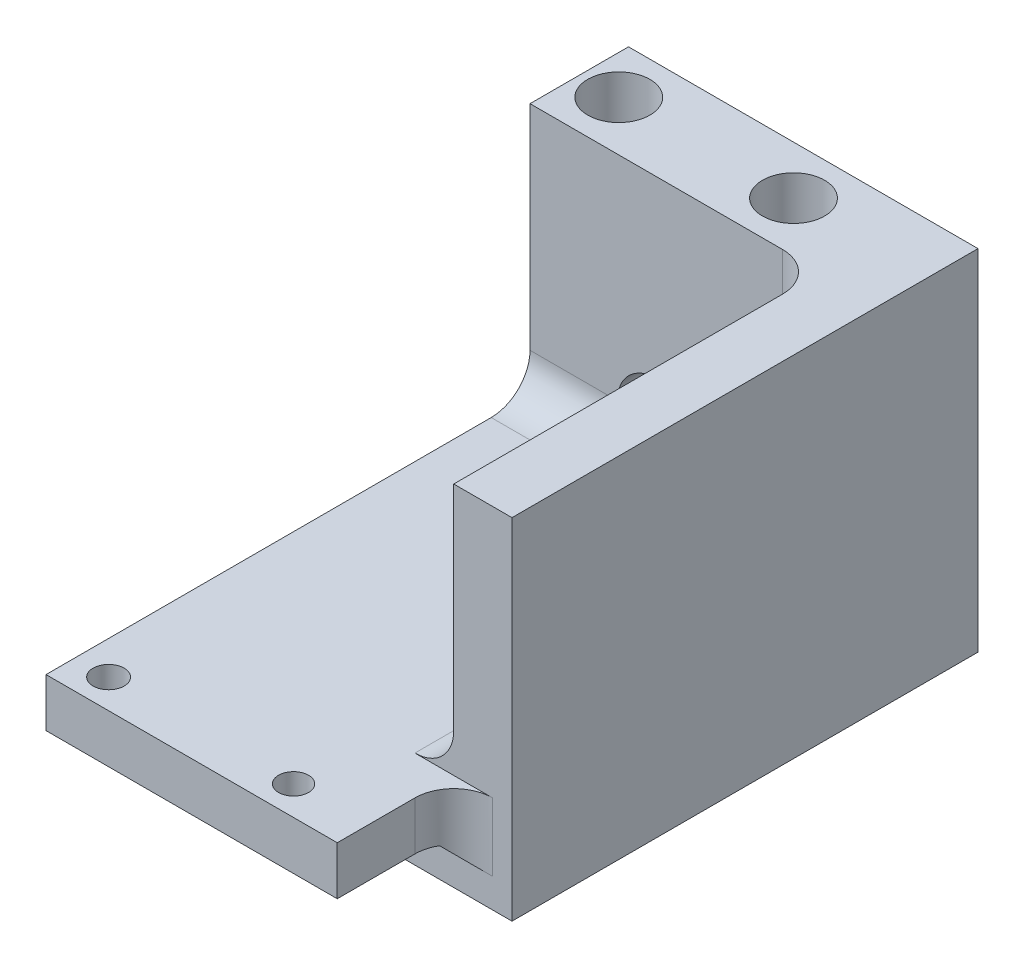
ISO-10303-21;
HEADER;
FILE_DESCRIPTION(('STEP AP214'),'2;1');
FILE_NAME('part.step','',(''),(''),'','','');
FILE_SCHEMA(('AUTOMOTIVE_DESIGN { 1 0 10303 214 1 1 1 1 }'));
ENDSEC;
DATA;
#1=APPLICATION_CONTEXT('core data for automotive mechanical design processes');
#2=APPLICATION_PROTOCOL_DEFINITION('international standard','automotive_design',2000,#1);
#3=PRODUCT_CONTEXT('',#1,'mechanical');
#4=PRODUCT('Part','Part','',(#3));
#5=PRODUCT_RELATED_PRODUCT_CATEGORY('part','',(#4));
#6=PRODUCT_DEFINITION_FORMATION('','',#4);
#7=PRODUCT_DEFINITION_CONTEXT('part definition',#1,'design');
#8=PRODUCT_DEFINITION('design','',#6,#7);
#9=PRODUCT_DEFINITION_SHAPE('','',#8);
#10=(LENGTH_UNIT() NAMED_UNIT(*) SI_UNIT(.MILLI.,.METRE.));
#11=(NAMED_UNIT(*) PLANE_ANGLE_UNIT() SI_UNIT($,.RADIAN.));
#12=(NAMED_UNIT(*) SI_UNIT($,.STERADIAN.) SOLID_ANGLE_UNIT());
#13=UNCERTAINTY_MEASURE_WITH_UNIT(LENGTH_MEASURE(1.E-05),#10,'distance_accuracy_value','');
#14=(GEOMETRIC_REPRESENTATION_CONTEXT(3) GLOBAL_UNCERTAINTY_ASSIGNED_CONTEXT((#13)) GLOBAL_UNIT_ASSIGNED_CONTEXT((#10,
#11,#12)) REPRESENTATION_CONTEXT('',''));
#15=CARTESIAN_POINT('',(0.,0.,0.));
#16=DIRECTION('',(0.,0.,1.));
#17=DIRECTION('',(1.,0.,0.));
#18=AXIS2_PLACEMENT_3D('',#15,#16,#17);
#19=CARTESIAN_POINT('',(30.,36.,0.));
#20=DIRECTION('',(-1.,0.,0.));
#21=DIRECTION('',(0.,0.,1.));
#22=AXIS2_PLACEMENT_3D('',#19,#20,#21);
#23=PLANE('',#22);
#24=DIRECTION('',(0.,0.,1.));
#25=VECTOR('',#24,1.);
#26=CARTESIAN_POINT('',(30.,5.,0.));
#27=LINE('',#26,#25);
#28=CARTESIAN_POINT('',(30.,5.,-8.));
#29=VERTEX_POINT('',#28);
#30=CARTESIAN_POINT('',(30.,5.,0.));
#31=VERTEX_POINT('',#30);
#32=EDGE_CURVE('E221',#29,#31,#27,.T.);
#33=ORIENTED_EDGE('',*,*,#32,.F.);
#34=DIRECTION('',(0.,-1.,0.));
#35=VECTOR('',#34,1.);
#36=CARTESIAN_POINT('',(30.,10.,-8.));
#37=LINE('',#36,#35);
#38=CARTESIAN_POINT('',(30.,10.,-8.));
#39=VERTEX_POINT('',#38);
#40=EDGE_CURVE('E288',#29,#39,#37,.F.);
#41=ORIENTED_EDGE('',*,*,#40,.T.);
#42=DIRECTION('',(0.,0.,-1.));
#43=VECTOR('',#42,1.);
#44=CARTESIAN_POINT('',(30.,10.,0.));
#45=LINE('',#44,#43);
#46=CARTESIAN_POINT('',(30.,10.,0.));
#47=VERTEX_POINT('',#46);
#48=EDGE_CURVE('E235',#47,#39,#45,.T.);
#49=ORIENTED_EDGE('',*,*,#48,.F.);
#50=DIRECTION('',(0.,-1.,0.));
#51=VECTOR('',#50,1.);
#52=CARTESIAN_POINT('',(30.,36.,0.));
#53=LINE('',#52,#51);
#54=EDGE_CURVE('E263',#47,#31,#53,.T.);
#55=ORIENTED_EDGE('',*,*,#54,.T.);
#56=EDGE_LOOP('',(#33,#41,#49,#55));
#57=FACE_BOUND('',#56,.T.);
#58=ADVANCED_FACE('F45',(#57),#23,.F.);
#59=CARTESIAN_POINT('',(4.,36.,-55.));
#60=DIRECTION('',(0.,-1.,0.));
#61=DIRECTION('',(0.,0.,-1.));
#62=AXIS2_PLACEMENT_3D('',#59,#60,#61);
#63=CYLINDRICAL_SURFACE('',#62,1.6);
#64=CARTESIAN_POINT('',(4.,0.,-55.));
#65=DIRECTION('',(0.,1.,0.));
#66=DIRECTION('',(0.,0.,1.));
#67=AXIS2_PLACEMENT_3D('',#64,#65,#66);
#68=CIRCLE('',#67,1.6);
#69=CARTESIAN_POINT('',(4.,0.,-53.4));
#70=VERTEX_POINT('',#69);
#71=EDGE_CURVE('E249',#70,#70,#68,.T.);
#72=ORIENTED_EDGE('',*,*,#71,.F.);
#73=EDGE_LOOP('',(#72));
#74=FACE_BOUND('',#73,.T.);
#75=CARTESIAN_POINT('',(4.,10.,-55.));
#76=DIRECTION('',(0.,1.,0.));
#77=DIRECTION('',(0.,0.,1.));
#78=AXIS2_PLACEMENT_3D('',#75,#76,#77);
#79=CIRCLE('',#78,1.6);
#80=CARTESIAN_POINT('',(4.,10.,-53.4));
#81=VERTEX_POINT('',#80);
#82=EDGE_CURVE('E173',#81,#81,#79,.T.);
#83=ORIENTED_EDGE('',*,*,#82,.T.);
#84=EDGE_LOOP('',(#83));
#85=FACE_BOUND('',#84,.T.);
#86=ADVANCED_FACE('F390',(#74,#85),#63,.F.);
#87=CARTESIAN_POINT('',(22.,36.,-55.));
#88=DIRECTION('',(0.,-1.,0.));
#89=DIRECTION('',(0.,0.,-1.));
#90=AXIS2_PLACEMENT_3D('',#87,#88,#89);
#91=CYLINDRICAL_SURFACE('',#90,1.6);
#92=CARTESIAN_POINT('',(22.,0.,-55.));
#93=DIRECTION('',(0.,1.,0.));
#94=DIRECTION('',(0.,0.,1.));
#95=AXIS2_PLACEMENT_3D('',#92,#93,#94);
#96=CIRCLE('',#95,1.6);
#97=CARTESIAN_POINT('',(22.,0.,-53.4));
#98=VERTEX_POINT('',#97);
#99=EDGE_CURVE('E246',#98,#98,#96,.T.);
#100=ORIENTED_EDGE('',*,*,#99,.F.);
#101=EDGE_LOOP('',(#100));
#102=FACE_BOUND('',#101,.T.);
#103=CARTESIAN_POINT('',(22.,10.,-55.));
#104=DIRECTION('',(0.,1.,0.));
#105=DIRECTION('',(0.,0.,1.));
#106=AXIS2_PLACEMENT_3D('',#103,#104,#105);
#107=CIRCLE('',#106,1.6);
#108=CARTESIAN_POINT('',(22.,10.,-53.4));
#109=VERTEX_POINT('',#108);
#110=EDGE_CURVE('E210',#109,#109,#107,.T.);
#111=ORIENTED_EDGE('',*,*,#110,.T.);
#112=EDGE_LOOP('',(#111));
#113=FACE_BOUND('',#112,.T.);
#114=ADVANCED_FACE('F397',(#102,#113),#91,.F.);
#115=CARTESIAN_POINT('',(0.,36.,0.));
#116=DIRECTION('',(0.,0.,-1.));
#117=DIRECTION('',(-1.,0.,0.));
#118=AXIS2_PLACEMENT_3D('',#115,#116,#117);
#119=PLANE('',#118);
#120=DIRECTION('',(-1.,0.,0.));
#121=VECTOR('',#120,1.);
#122=CARTESIAN_POINT('',(0.,5.,0.));
#123=LINE('',#122,#121);
#124=CARTESIAN_POINT('',(0.,5.,0.));
#125=VERTEX_POINT('',#124);
#126=EDGE_CURVE('E223',#31,#125,#123,.T.);
#127=ORIENTED_EDGE('',*,*,#126,.F.);
#128=ORIENTED_EDGE('',*,*,#54,.F.);
#129=DIRECTION('',(1.,0.,0.));
#130=VECTOR('',#129,1.);
#131=CARTESIAN_POINT('',(0.,10.,0.));
#132=LINE('',#131,#130);
#133=CARTESIAN_POINT('',(0.,10.,0.));
#134=VERTEX_POINT('',#133);
#135=EDGE_CURVE('E233',#134,#47,#132,.T.);
#136=ORIENTED_EDGE('',*,*,#135,.F.);
#137=DIRECTION('',(0.,-1.,0.));
#138=VECTOR('',#137,1.);
#139=CARTESIAN_POINT('',(0.,36.,0.));
#140=LINE('',#139,#138);
#141=EDGE_CURVE('E266',#134,#125,#140,.T.);
#142=ORIENTED_EDGE('',*,*,#141,.T.);
#143=EDGE_LOOP('',(#127,#128,#136,#142));
#144=FACE_BOUND('',#143,.T.);
#145=ADVANCED_FACE('F385',(#144),#119,.F.);
#146=CARTESIAN_POINT('',(3.45,36.,-3.));
#147=DIRECTION('',(0.,-1.,0.));
#148=DIRECTION('',(0.,0.,-1.));
#149=AXIS2_PLACEMENT_3D('',#146,#147,#148);
#150=CYLINDRICAL_SURFACE('',#149,1.6);
#151=CARTESIAN_POINT('',(3.45,10.,-3.));
#152=DIRECTION('',(0.,-1.,0.));
#153=DIRECTION('',(0.,0.,-1.));
#154=AXIS2_PLACEMENT_3D('',#151,#152,#153);
#155=CIRCLE('',#154,1.6);
#156=CARTESIAN_POINT('',(3.45,10.,-4.6));
#157=VERTEX_POINT('',#156);
#158=EDGE_CURVE('E243',#157,#157,#155,.T.);
#159=ORIENTED_EDGE('',*,*,#158,.F.);
#160=EDGE_LOOP('',(#159));
#161=FACE_BOUND('',#160,.T.);
#162=CARTESIAN_POINT('',(3.45,5.,-3.));
#163=DIRECTION('',(0.,-1.,0.));
#164=DIRECTION('',(0.,0.,-1.));
#165=AXIS2_PLACEMENT_3D('',#162,#163,#164);
#166=CIRCLE('',#165,1.6);
#167=CARTESIAN_POINT('',(3.45,5.,-4.6));
#168=VERTEX_POINT('',#167);
#169=EDGE_CURVE('E227',#168,#168,#166,.T.);
#170=ORIENTED_EDGE('',*,*,#169,.T.);
#171=EDGE_LOOP('',(#170));
#172=FACE_BOUND('',#171,.T.);
#173=ADVANCED_FACE('F405',(#161,#172),#150,.F.);
#174=CARTESIAN_POINT('',(22.5,36.,-3.));
#175=DIRECTION('',(0.,-1.,0.));
#176=DIRECTION('',(0.,0.,-1.));
#177=AXIS2_PLACEMENT_3D('',#174,#175,#176);
#178=CYLINDRICAL_SURFACE('',#177,1.54453652487778);
#179=CARTESIAN_POINT('',(22.5,10.,-3.));
#180=DIRECTION('',(0.,-1.,0.));
#181=DIRECTION('',(0.,0.,-1.));
#182=AXIS2_PLACEMENT_3D('',#179,#180,#181);
#183=CIRCLE('',#182,1.54453652487778);
#184=CARTESIAN_POINT('',(22.5,10.,-4.54453652487778));
#185=VERTEX_POINT('',#184);
#186=EDGE_CURVE('E242',#185,#185,#183,.T.);
#187=ORIENTED_EDGE('',*,*,#186,.F.);
#188=EDGE_LOOP('',(#187));
#189=FACE_BOUND('',#188,.T.);
#190=CARTESIAN_POINT('',(22.5,5.,-3.));
#191=DIRECTION('',(0.,-1.,0.));
#192=DIRECTION('',(0.,0.,-1.));
#193=AXIS2_PLACEMENT_3D('',#190,#191,#192);
#194=CIRCLE('',#193,1.54453652487778);
#195=CARTESIAN_POINT('',(22.5,5.,-4.54453652487778));
#196=VERTEX_POINT('',#195);
#197=EDGE_CURVE('E226',#196,#196,#194,.T.);
#198=ORIENTED_EDGE('',*,*,#197,.T.);
#199=EDGE_LOOP('',(#198));
#200=FACE_BOUND('',#199,.T.);
#201=ADVANCED_FACE('F482',(#189,#200),#178,.F.);
#202=CARTESIAN_POINT('',(0.,36.,0.));
#203=DIRECTION('',(0.,-1.,0.));
#204=DIRECTION('',(0.,0.,-1.));
#205=AXIS2_PLACEMENT_3D('',#202,#203,#204);
#206=PLANE('',#205);
#207=CARTESIAN_POINT('',(4.,36.,-55.));
#208=DIRECTION('',(0.,1.,0.));
#209=DIRECTION('',(0.,0.,1.));
#210=AXIS2_PLACEMENT_3D('',#207,#208,#209);
#211=CIRCLE('',#210,3.2);
#212=CARTESIAN_POINT('',(4.,36.,-51.8));
#213=VERTEX_POINT('',#212);
#214=EDGE_CURVE('E211',#213,#213,#211,.T.);
#215=ORIENTED_EDGE('',*,*,#214,.F.);
#216=EDGE_LOOP('',(#215));
#217=FACE_BOUND('',#216,.T.);
#218=CARTESIAN_POINT('',(22.,36.,-55.));
#219=DIRECTION('',(0.,1.,0.));
#220=DIRECTION('',(0.,0.,1.));
#221=AXIS2_PLACEMENT_3D('',#218,#219,#220);
#222=CIRCLE('',#221,3.2);
#223=CARTESIAN_POINT('',(22.,36.,-51.8));
#224=VERTEX_POINT('',#223);
#225=EDGE_CURVE('E214',#224,#224,#222,.T.);
#226=ORIENTED_EDGE('',*,*,#225,.F.);
#227=EDGE_LOOP('',(#226));
#228=FACE_BOUND('',#227,.T.);
#229=DIRECTION('',(0.,0.,1.));
#230=VECTOR('',#229,1.);
#231=CARTESIAN_POINT('',(0.,36.,0.));
#232=LINE('',#231,#230);
#233=CARTESIAN_POINT('',(0.,36.,-60.));
#234=VERTEX_POINT('',#233);
#235=CARTESIAN_POINT('',(0.,36.,-49.8560059654673));
#236=VERTEX_POINT('',#235);
#237=EDGE_CURVE('E253',#234,#236,#232,.T.);
#238=ORIENTED_EDGE('',*,*,#237,.T.);
#239=DIRECTION('',(-1.,0.,0.));
#240=VECTOR('',#239,1.);
#241=CARTESIAN_POINT('',(0.,36.,-49.8560059654673));
#242=LINE('',#241,#240);
#243=CARTESIAN_POINT('',(26.,36.,-49.8560059654673));
#244=VERTEX_POINT('',#243);
#245=EDGE_CURVE('E230',#244,#236,#242,.T.);
#246=ORIENTED_EDGE('',*,*,#245,.F.);
#247=CARTESIAN_POINT('',(26.,36.,-45.8560059654673));
#248=DIRECTION('',(0.,-1.,0.));
#249=DIRECTION('',(0.,0.,-1.));
#250=AXIS2_PLACEMENT_3D('',#247,#248,#249);
#251=CIRCLE('',#250,4.);
#252=CARTESIAN_POINT('',(30.,36.,-45.8560059654673));
#253=VERTEX_POINT('',#252);
#254=EDGE_CURVE('E70',#244,#253,#251,.T.);
#255=ORIENTED_EDGE('',*,*,#254,.T.);
#256=DIRECTION('',(0.,0.,1.));
#257=VECTOR('',#256,1.);
#258=CARTESIAN_POINT('',(30.,36.,-12.));
#259=LINE('',#258,#257);
#260=CARTESIAN_POINT('',(30.,36.,-12.));
#261=VERTEX_POINT('',#260);
#262=EDGE_CURVE('E189',#253,#261,#259,.T.);
#263=ORIENTED_EDGE('',*,*,#262,.T.);
#264=DIRECTION('',(-1.,0.,0.));
#265=VECTOR('',#264,1.);
#266=CARTESIAN_POINT('',(36.,36.,-12.));
#267=LINE('',#266,#265);
#268=CARTESIAN_POINT('',(36.,36.,-12.));
#269=VERTEX_POINT('',#268);
#270=EDGE_CURVE('E196',#269,#261,#267,.T.);
#271=ORIENTED_EDGE('',*,*,#270,.F.);
#272=DIRECTION('',(0.,0.,1.));
#273=VECTOR('',#272,1.);
#274=CARTESIAN_POINT('',(36.,36.,-12.));
#275=LINE('',#274,#273);
#276=CARTESIAN_POINT('',(36.,36.,-60.));
#277=VERTEX_POINT('',#276);
#278=EDGE_CURVE('E187',#277,#269,#275,.T.);
#279=ORIENTED_EDGE('',*,*,#278,.F.);
#280=DIRECTION('',(-1.,0.,0.));
#281=VECTOR('',#280,1.);
#282=CARTESIAN_POINT('',(0.,36.,-60.));
#283=LINE('',#282,#281);
#284=EDGE_CURVE('E256',#277,#234,#283,.T.);
#285=ORIENTED_EDGE('',*,*,#284,.T.);
#286=EDGE_LOOP('',(#238,#246,#255,#263,#271,#279,#285));
#287=FACE_BOUND('',#286,.T.);
#288=ADVANCED_FACE('F358',(#217,#228,#287),#206,.F.);
#289=CARTESIAN_POINT('',(0.,0.,0.));
#290=DIRECTION('',(0.,-1.,0.));
#291=DIRECTION('',(0.,0.,-1.));
#292=AXIS2_PLACEMENT_3D('',#289,#290,#291);
#293=PLANE('',#292);
#294=DIRECTION('',(1.,0.,0.));
#295=VECTOR('',#294,1.);
#296=CARTESIAN_POINT('',(0.,0.,-12.));
#297=LINE('',#296,#295);
#298=CARTESIAN_POINT('',(0.,0.,-12.));
#299=VERTEX_POINT('',#298);
#300=CARTESIAN_POINT('',(36.,0.,-12.));
#301=VERTEX_POINT('',#300);
#302=EDGE_CURVE('E160',#299,#301,#297,.T.);
#303=ORIENTED_EDGE('',*,*,#302,.F.);
#304=DIRECTION('',(0.,0.,1.));
#305=VECTOR('',#304,1.);
#306=CARTESIAN_POINT('',(0.,0.,0.));
#307=LINE('',#306,#305);
#308=CARTESIAN_POINT('',(0.,0.,-60.));
#309=VERTEX_POINT('',#308);
#310=EDGE_CURVE('E252',#309,#299,#307,.T.);
#311=ORIENTED_EDGE('',*,*,#310,.F.);
#312=DIRECTION('',(-1.,0.,0.));
#313=VECTOR('',#312,1.);
#314=CARTESIAN_POINT('',(0.,0.,-60.));
#315=LINE('',#314,#313);
#316=CARTESIAN_POINT('',(36.,0.,-60.));
#317=VERTEX_POINT('',#316);
#318=EDGE_CURVE('E179',#317,#309,#315,.T.);
#319=ORIENTED_EDGE('',*,*,#318,.F.);
#320=DIRECTION('',(0.,0.,-1.));
#321=VECTOR('',#320,1.);
#322=CARTESIAN_POINT('',(36.,0.,-12.));
#323=LINE('',#322,#321);
#324=EDGE_CURVE('E176',#301,#317,#323,.T.);
#325=ORIENTED_EDGE('',*,*,#324,.F.);
#326=EDGE_LOOP('',(#303,#311,#319,#325));
#327=FACE_BOUND('',#326,.T.);
#328=ORIENTED_EDGE('',*,*,#71,.T.);
#329=EDGE_LOOP('',(#328));
#330=FACE_BOUND('',#329,.T.);
#331=ORIENTED_EDGE('',*,*,#99,.T.);
#332=EDGE_LOOP('',(#331));
#333=FACE_BOUND('',#332,.T.);
#334=ADVANCED_FACE('F177',(#327,#330,#333),#293,.T.);
#335=CARTESIAN_POINT('',(0.,36.,0.));
#336=DIRECTION('',(1.,0.,0.));
#337=DIRECTION('',(0.,0.,-1.));
#338=AXIS2_PLACEMENT_3D('',#335,#336,#337);
#339=PLANE('',#338);
#340=ORIENTED_EDGE('',*,*,#310,.T.);
#341=DIRECTION('',(0.,-1.,0.));
#342=VECTOR('',#341,1.);
#343=CARTESIAN_POINT('',(0.,5.,-12.));
#344=LINE('',#343,#342);
#345=CARTESIAN_POINT('',(0.,3.00000000000001,-12.));
#346=VERTEX_POINT('',#345);
#347=EDGE_CURVE('E168',#346,#299,#344,.T.);
#348=ORIENTED_EDGE('',*,*,#347,.F.);
#349=DIRECTION('',(0.,0.707106781186544,0.707106781186551));
#350=VECTOR('',#349,1.);
#351=CARTESIAN_POINT('',(0.,25.4999999999998,10.5000000000001));
#352=LINE('',#351,#350);
#353=CARTESIAN_POINT('',(0.,5.,-9.99999999999998));
#354=VERTEX_POINT('',#353);
#355=EDGE_CURVE('E281',#346,#354,#352,.T.);
#356=ORIENTED_EDGE('',*,*,#355,.T.);
#357=DIRECTION('',(0.,0.,-1.));
#358=VECTOR('',#357,1.);
#359=CARTESIAN_POINT('',(0.,5.,0.));
#360=LINE('',#359,#358);
#361=EDGE_CURVE('E172',#125,#354,#360,.T.);
#362=ORIENTED_EDGE('',*,*,#361,.F.);
#363=ORIENTED_EDGE('',*,*,#141,.F.);
#364=DIRECTION('',(0.,0.,1.));
#365=VECTOR('',#364,1.);
#366=CARTESIAN_POINT('',(0.,10.,0.));
#367=LINE('',#366,#365);
#368=CARTESIAN_POINT('',(0.,10.,-45.8560059654673));
#369=VERTEX_POINT('',#368);
#370=EDGE_CURVE('E231',#369,#134,#367,.T.);
#371=ORIENTED_EDGE('',*,*,#370,.F.);
#372=CARTESIAN_POINT('',(0.,14.,-45.8560059654673));
#373=DIRECTION('',(1.,0.,0.));
#374=DIRECTION('',(0.,0.,-1.));
#375=AXIS2_PLACEMENT_3D('',#372,#373,#374);
#376=CIRCLE('',#375,4.);
#377=CARTESIAN_POINT('',(0.,14.,-49.8560059654673));
#378=VERTEX_POINT('',#377);
#379=EDGE_CURVE('E313',#369,#378,#376,.T.);
#380=ORIENTED_EDGE('',*,*,#379,.T.);
#381=DIRECTION('',(0.,1.,0.));
#382=VECTOR('',#381,1.);
#383=CARTESIAN_POINT('',(0.,10.,-49.8560059654673));
#384=LINE('',#383,#382);
#385=EDGE_CURVE('E238',#378,#236,#384,.T.);
#386=ORIENTED_EDGE('',*,*,#385,.T.);
#387=ORIENTED_EDGE('',*,*,#237,.F.);
#388=DIRECTION('',(0.,-1.,0.));
#389=VECTOR('',#388,1.);
#390=CARTESIAN_POINT('',(0.,36.,-60.));
#391=LINE('',#390,#389);
#392=EDGE_CURVE('E258',#234,#309,#391,.T.);
#393=ORIENTED_EDGE('',*,*,#392,.T.);
#394=EDGE_LOOP('',(#340,#348,#356,#362,#363,#371,#380,#386,#387,#393));
#395=FACE_BOUND('',#394,.T.);
#396=ADVANCED_FACE('F353',(#395),#339,.F.);
#397=CARTESIAN_POINT('',(0.,36.,-60.));
#398=DIRECTION('',(0.,0.,1.));
#399=DIRECTION('',(1.,0.,0.));
#400=AXIS2_PLACEMENT_3D('',#397,#398,#399);
#401=PLANE('',#400);
#402=CARTESIAN_POINT('',(13.,14.,-60.));
#403=DIRECTION('',(0.,0.,-1.));
#404=DIRECTION('',(-1.,0.,0.));
#405=AXIS2_PLACEMENT_3D('',#402,#403,#404);
#406=CIRCLE('',#405,4.);
#407=CARTESIAN_POINT('',(9.,14.,-60.));
#408=VERTEX_POINT('',#407);
#409=EDGE_CURVE('E200',#408,#408,#406,.T.);
#410=ORIENTED_EDGE('',*,*,#409,.F.);
#411=EDGE_LOOP('',(#410));
#412=FACE_BOUND('',#411,.T.);
#413=ORIENTED_EDGE('',*,*,#318,.T.);
#414=ORIENTED_EDGE('',*,*,#392,.F.);
#415=ORIENTED_EDGE('',*,*,#284,.F.);
#416=DIRECTION('',(0.,1.,0.));
#417=VECTOR('',#416,1.);
#418=CARTESIAN_POINT('',(36.,0.,-60.));
#419=LINE('',#418,#417);
#420=EDGE_CURVE('E183',#317,#277,#419,.T.);
#421=ORIENTED_EDGE('',*,*,#420,.F.);
#422=EDGE_LOOP('',(#413,#414,#415,#421));
#423=FACE_BOUND('',#422,.T.);
#424=ADVANCED_FACE('F361',(#412,#423),#401,.F.);
#425=CARTESIAN_POINT('',(0.,10.,-49.8560059654673));
#426=DIRECTION('',(0.,0.,-1.));
#427=DIRECTION('',(-1.,0.,0.));
#428=AXIS2_PLACEMENT_3D('',#425,#426,#427);
#429=PLANE('',#428);
#430=ORIENTED_EDGE('',*,*,#385,.F.);
#431=DIRECTION('',(-1.,0.,0.));
#432=VECTOR('',#431,1.);
#433=CARTESIAN_POINT('',(13.,14.,-49.8560059654673));
#434=LINE('',#433,#432);
#435=CARTESIAN_POINT('',(9.,14.,-49.8560059654673));
#436=VERTEX_POINT('',#435);
#437=EDGE_CURVE('E308',#378,#436,#434,.F.);
#438=ORIENTED_EDGE('',*,*,#437,.T.);
#439=CARTESIAN_POINT('',(13.,14.,-49.8560059654673));
#440=DIRECTION('',(0.,0.,-1.));
#441=DIRECTION('',(-1.,0.,0.));
#442=AXIS2_PLACEMENT_3D('',#439,#440,#441);
#443=CIRCLE('',#442,4.);
#444=CARTESIAN_POINT('',(17.,14.,-49.8560059654673));
#445=VERTEX_POINT('',#444);
#446=EDGE_CURVE('E203',#436,#445,#443,.T.);
#447=ORIENTED_EDGE('',*,*,#446,.T.);
#448=DIRECTION('',(-1.,0.,0.));
#449=VECTOR('',#448,1.);
#450=CARTESIAN_POINT('',(30.,14.,-49.8560059654673));
#451=LINE('',#450,#449);
#452=CARTESIAN_POINT('',(26.,14.,-49.8560059654673));
#453=VERTEX_POINT('',#452);
#454=EDGE_CURVE('E304',#445,#453,#451,.F.);
#455=ORIENTED_EDGE('',*,*,#454,.T.);
#456=DIRECTION('',(0.,1.,0.));
#457=VECTOR('',#456,1.);
#458=CARTESIAN_POINT('',(26.,10.,-49.8560059654673));
#459=LINE('',#458,#457);
#460=EDGE_CURVE('E306',#453,#244,#459,.T.);
#461=ORIENTED_EDGE('',*,*,#460,.T.);
#462=ORIENTED_EDGE('',*,*,#245,.T.);
#463=EDGE_LOOP('',(#430,#438,#447,#455,#461,#462));
#464=FACE_BOUND('',#463,.T.);
#465=ADVANCED_FACE('F357',(#464),#429,.F.);
#466=CARTESIAN_POINT('',(0.,10.,0.));
#467=DIRECTION('',(0.,-1.,0.));
#468=DIRECTION('',(0.,0.,-1.));
#469=AXIS2_PLACEMENT_3D('',#466,#467,#468);
#470=PLANE('',#469);
#471=DIRECTION('',(1.,0.,0.));
#472=VECTOR('',#471,1.);
#473=CARTESIAN_POINT('',(0.,10.,-12.));
#474=LINE('',#473,#472);
#475=CARTESIAN_POINT('',(26.,10.,-12.));
#476=VERTEX_POINT('',#475);
#477=CARTESIAN_POINT('',(34.,10.,-12.));
#478=VERTEX_POINT('',#477);
#479=EDGE_CURVE('E283',#476,#478,#474,.T.);
#480=ORIENTED_EDGE('',*,*,#479,.F.);
#481=DIRECTION('',(0.,0.,-1.));
#482=VECTOR('',#481,1.);
#483=CARTESIAN_POINT('',(26.,10.,0.));
#484=LINE('',#483,#482);
#485=CARTESIAN_POINT('',(26.,10.,-45.8560059654673));
#486=VERTEX_POINT('',#485);
#487=EDGE_CURVE('E299',#476,#486,#484,.T.);
#488=ORIENTED_EDGE('',*,*,#487,.T.);
#489=DIRECTION('',(-1.,0.,0.));
#490=VECTOR('',#489,1.);
#491=CARTESIAN_POINT('',(13.,10.,-45.8560059654673));
#492=LINE('',#491,#490);
#493=CARTESIAN_POINT('',(13.,10.,-45.8560059654673));
#494=VERTEX_POINT('',#493);
#495=EDGE_CURVE('E297',#486,#494,#492,.T.);
#496=ORIENTED_EDGE('',*,*,#495,.T.);
#497=DIRECTION('',(-1.,0.,0.));
#498=VECTOR('',#497,1.);
#499=CARTESIAN_POINT('',(0.,10.,-45.8560059654673));
#500=LINE('',#499,#498);
#501=EDGE_CURVE('E301',#494,#369,#500,.T.);
#502=ORIENTED_EDGE('',*,*,#501,.T.);
#503=ORIENTED_EDGE('',*,*,#370,.T.);
#504=ORIENTED_EDGE('',*,*,#135,.T.);
#505=ORIENTED_EDGE('',*,*,#48,.T.);
#506=CARTESIAN_POINT('',(34.,10.,-8.));
#507=DIRECTION('',(0.,-1.,0.));
#508=DIRECTION('',(0.,0.,-1.));
#509=AXIS2_PLACEMENT_3D('',#506,#507,#508);
#510=CIRCLE('',#509,4.);
#511=EDGE_CURVE('E295',#39,#478,#510,.T.);
#512=ORIENTED_EDGE('',*,*,#511,.T.);
#513=EDGE_LOOP('',(#480,#488,#496,#502,#503,#504,#505,#512));
#514=FACE_BOUND('',#513,.T.);
#515=ORIENTED_EDGE('',*,*,#158,.T.);
#516=EDGE_LOOP('',(#515));
#517=FACE_BOUND('',#516,.T.);
#518=ORIENTED_EDGE('',*,*,#186,.T.);
#519=EDGE_LOOP('',(#518));
#520=FACE_BOUND('',#519,.T.);
#521=ADVANCED_FACE('F340',(#514,#517,#520),#470,.F.);
#522=CARTESIAN_POINT('',(0.,5.,-12.));
#523=DIRECTION('',(0.,0.,-1.));
#524=DIRECTION('',(-1.,0.,0.));
#525=AXIS2_PLACEMENT_3D('',#522,#523,#524);
#526=PLANE('',#525);
#527=DIRECTION('',(0.,-1.,0.));
#528=VECTOR('',#527,1.);
#529=CARTESIAN_POINT('',(34.,3.00000000000001,-12.));
#530=LINE('',#529,#528);
#531=CARTESIAN_POINT('',(34.,3.00000000000001,-12.));
#532=VERTEX_POINT('',#531);
#533=EDGE_CURVE('E286',#478,#532,#530,.T.);
#534=ORIENTED_EDGE('',*,*,#533,.T.);
#535=DIRECTION('',(-1.,0.,0.));
#536=VECTOR('',#535,1.);
#537=CARTESIAN_POINT('',(0.,3.00000000000001,-12.));
#538=LINE('',#537,#536);
#539=EDGE_CURVE('E279',#532,#346,#538,.T.);
#540=ORIENTED_EDGE('',*,*,#539,.T.);
#541=ORIENTED_EDGE('',*,*,#347,.T.);
#542=ORIENTED_EDGE('',*,*,#302,.T.);
#543=DIRECTION('',(0.,-1.,0.));
#544=VECTOR('',#543,1.);
#545=CARTESIAN_POINT('',(36.,0.,-12.));
#546=LINE('',#545,#544);
#547=EDGE_CURVE('E166',#269,#301,#546,.T.);
#548=ORIENTED_EDGE('',*,*,#547,.F.);
#549=ORIENTED_EDGE('',*,*,#270,.T.);
#550=DIRECTION('',(0.,-1.,0.));
#551=VECTOR('',#550,1.);
#552=CARTESIAN_POINT('',(30.,0.,-12.));
#553=LINE('',#552,#551);
#554=CARTESIAN_POINT('',(30.,14.,-12.));
#555=VERTEX_POINT('',#554);
#556=EDGE_CURVE('E191',#261,#555,#553,.T.);
#557=ORIENTED_EDGE('',*,*,#556,.T.);
#558=CARTESIAN_POINT('',(26.,14.,-12.));
#559=DIRECTION('',(0.,0.,-1.));
#560=DIRECTION('',(-1.,0.,0.));
#561=AXIS2_PLACEMENT_3D('',#558,#559,#560);
#562=CIRCLE('',#561,4.);
#563=EDGE_CURVE('E54',#555,#476,#562,.T.);
#564=ORIENTED_EDGE('',*,*,#563,.T.);
#565=ORIENTED_EDGE('',*,*,#479,.T.);
#566=EDGE_LOOP('',(#534,#540,#541,#542,#548,#549,#557,#564,#565));
#567=FACE_BOUND('',#566,.T.);
#568=ADVANCED_FACE('F163',(#567),#526,.F.);
#569=CARTESIAN_POINT('',(0.,5.,0.));
#570=DIRECTION('',(0.,-1.,0.));
#571=DIRECTION('',(0.,0.,-1.));
#572=AXIS2_PLACEMENT_3D('',#569,#570,#571);
#573=PLANE('',#572);
#574=ORIENTED_EDGE('',*,*,#169,.F.);
#575=EDGE_LOOP('',(#574));
#576=FACE_BOUND('',#575,.T.);
#577=ORIENTED_EDGE('',*,*,#197,.F.);
#578=EDGE_LOOP('',(#577));
#579=FACE_BOUND('',#578,.T.);
#580=ORIENTED_EDGE('',*,*,#361,.T.);
#581=DIRECTION('',(1.,0.,0.));
#582=VECTOR('',#581,1.);
#583=CARTESIAN_POINT('',(0.,5.,-9.99999999999998));
#584=LINE('',#583,#582);
#585=CARTESIAN_POINT('',(30.5358983848622,5.,-9.99999999999998));
#586=VERTEX_POINT('',#585);
#587=EDGE_CURVE('E269',#354,#586,#584,.T.);
#588=ORIENTED_EDGE('',*,*,#587,.T.);
#589=CARTESIAN_POINT('',(34.,5.,-8.));
#590=DIRECTION('',(0.,-1.,0.));
#591=DIRECTION('',(0.,0.,-1.));
#592=AXIS2_PLACEMENT_3D('',#589,#590,#591);
#593=CIRCLE('',#592,4.);
#594=EDGE_CURVE('E293',#586,#29,#593,.F.);
#595=ORIENTED_EDGE('',*,*,#594,.T.);
#596=ORIENTED_EDGE('',*,*,#32,.T.);
#597=ORIENTED_EDGE('',*,*,#126,.T.);
#598=EDGE_LOOP('',(#580,#588,#595,#596,#597));
#599=FACE_BOUND('',#598,.T.);
#600=ADVANCED_FACE('F380',(#576,#579,#599),#573,.T.);
#601=CARTESIAN_POINT('',(22.,10.,-55.));
#602=DIRECTION('',(0.,1.,0.));
#603=DIRECTION('',(0.,0.,1.));
#604=AXIS2_PLACEMENT_3D('',#601,#602,#603);
#605=CYLINDRICAL_SURFACE('',#604,3.2);
#606=CARTESIAN_POINT('',(22.,10.,-55.));
#607=DIRECTION('',(0.,1.,0.));
#608=DIRECTION('',(0.,0.,1.));
#609=AXIS2_PLACEMENT_3D('',#606,#607,#608);
#610=CIRCLE('',#609,3.2);
#611=CARTESIAN_POINT('',(22.,10.,-51.8));
#612=VERTEX_POINT('',#611);
#613=EDGE_CURVE('E206',#612,#612,#610,.T.);
#614=CARTESIAN_POINT('',(22.,10.,-51.8));
#615=CARTESIAN_POINT('',(22.,10.2708333333333,-51.8));
#616=CARTESIAN_POINT('',(22.,10.5416666666667,-51.8));
#617=CARTESIAN_POINT('',(22.,11.0833333333333,-51.8));
#618=CARTESIAN_POINT('',(22.,11.3541666666667,-51.8));
#619=CARTESIAN_POINT('',(22.,11.8958333333333,-51.8));
#620=CARTESIAN_POINT('',(22.,12.1666666666667,-51.8));
#621=CARTESIAN_POINT('',(22.,12.7083333333333,-51.8));
#622=CARTESIAN_POINT('',(22.,12.9791666666667,-51.8));
#623=CARTESIAN_POINT('',(22.,13.5208333333333,-51.8));
#624=CARTESIAN_POINT('',(22.,13.7916666666667,-51.8));
#625=CARTESIAN_POINT('',(22.,14.3333333333333,-51.8));
#626=CARTESIAN_POINT('',(22.,14.6041666666667,-51.8));
#627=CARTESIAN_POINT('',(22.,15.1458333333333,-51.8));
#628=CARTESIAN_POINT('',(22.,15.4166666666667,-51.8));
#629=CARTESIAN_POINT('',(22.,15.9583333333333,-51.8));
#630=CARTESIAN_POINT('',(22.,16.2291666666667,-51.8));
#631=CARTESIAN_POINT('',(22.,16.7708333333333,-51.8));
#632=CARTESIAN_POINT('',(22.,17.0416666666667,-51.8));
#633=CARTESIAN_POINT('',(22.,17.5833333333333,-51.8));
#634=CARTESIAN_POINT('',(22.,17.8541666666667,-51.8));
#635=CARTESIAN_POINT('',(22.,18.3958333333333,-51.8));
#636=CARTESIAN_POINT('',(22.,18.6666666666667,-51.8));
#637=CARTESIAN_POINT('',(22.,19.2083333333333,-51.8));
#638=CARTESIAN_POINT('',(22.,19.4791666666667,-51.8));
#639=CARTESIAN_POINT('',(22.,20.0208333333333,-51.8));
#640=CARTESIAN_POINT('',(22.,20.2916666666667,-51.8));
#641=CARTESIAN_POINT('',(22.,20.8333333333333,-51.8));
#642=CARTESIAN_POINT('',(22.,21.1041666666667,-51.8));
#643=CARTESIAN_POINT('',(22.,21.6458333333333,-51.8));
#644=CARTESIAN_POINT('',(22.,21.9166666666667,-51.8));
#645=CARTESIAN_POINT('',(22.,22.4583333333333,-51.8));
#646=CARTESIAN_POINT('',(22.,22.7291666666667,-51.8));
#647=CARTESIAN_POINT('',(22.,23.2708333333333,-51.8));
#648=CARTESIAN_POINT('',(22.,23.5416666666667,-51.8));
#649=CARTESIAN_POINT('',(22.,24.0833333333333,-51.8));
#650=CARTESIAN_POINT('',(22.,24.3541666666667,-51.8));
#651=CARTESIAN_POINT('',(22.,24.8958333333333,-51.8));
#652=CARTESIAN_POINT('',(22.,25.1666666666667,-51.8));
#653=CARTESIAN_POINT('',(22.,25.7083333333333,-51.8));
#654=CARTESIAN_POINT('',(22.,25.9791666666667,-51.8));
#655=CARTESIAN_POINT('',(22.,26.5208333333333,-51.8));
#656=CARTESIAN_POINT('',(22.,26.7916666666667,-51.8));
#657=CARTESIAN_POINT('',(22.,27.3333333333333,-51.8));
#658=CARTESIAN_POINT('',(22.,27.6041666666667,-51.8));
#659=CARTESIAN_POINT('',(22.,28.1458333333333,-51.8));
#660=CARTESIAN_POINT('',(22.,28.4166666666667,-51.8));
#661=CARTESIAN_POINT('',(22.,28.9583333333333,-51.8));
#662=CARTESIAN_POINT('',(22.,29.2291666666667,-51.8));
#663=CARTESIAN_POINT('',(22.,29.7708333333333,-51.8));
#664=CARTESIAN_POINT('',(22.,30.0416666666667,-51.8));
#665=CARTESIAN_POINT('',(22.,30.5833333333333,-51.8));
#666=CARTESIAN_POINT('',(22.,30.8541666666667,-51.8));
#667=CARTESIAN_POINT('',(22.,31.3958333333333,-51.8));
#668=CARTESIAN_POINT('',(22.,31.6666666666667,-51.8));
#669=CARTESIAN_POINT('',(22.,32.2083333333333,-51.8));
#670=CARTESIAN_POINT('',(22.,32.4791666666667,-51.8));
#671=CARTESIAN_POINT('',(22.,33.0208333333333,-51.8));
#672=CARTESIAN_POINT('',(22.,33.2916666666667,-51.8));
#673=CARTESIAN_POINT('',(22.,33.8333333333333,-51.8));
#674=CARTESIAN_POINT('',(22.,34.1041666666667,-51.8));
#675=CARTESIAN_POINT('',(22.,34.6458333333333,-51.8));
#676=CARTESIAN_POINT('',(22.,34.9166666666667,-51.8));
#677=CARTESIAN_POINT('',(22.,35.4583333333333,-51.8));
#678=CARTESIAN_POINT('',(22.,35.7291666666667,-51.8));
#679=CARTESIAN_POINT('',(22.,36.,-51.8));
#680=B_SPLINE_CURVE_WITH_KNOTS('',3,(#614,#615,#616,#617,#618,#619,#620,#621,#622,#623,#624,
#625,#626,#627,#628,#629,#630,#631,#632,#633,#634,#635,#636,#637,#638,#639,#640,#641,#642,#643,
#644,#645,#646,#647,#648,#649,#650,#651,#652,#653,#654,#655,#656,#657,#658,#659,#660,#661,#662,
#663,#664,#665,#666,#667,#668,#669,#670,#671,#672,#673,#674,#675,#676,#677,#678,#679),
.UNSPECIFIED.,.F.,.F.,(4,2,2,2,2,2,2,2,2,2,2,2,2,2,2,2,2,2,2,2,2,2,2,2,2,2,2,2,2,2,2,2,4),(0.,
0.812499999999999,1.625,2.4375,3.25,4.0625,4.875,5.6875,6.5,7.3125,8.125,8.9375,9.75,10.5625,
11.375,12.1875,13.,13.8125,14.625,15.4375,16.25,17.0625,17.875,18.6875,19.5,20.3125,21.125,
21.9375,22.75,23.5625,24.375,25.1875,26.),.UNSPECIFIED.);
#681=EDGE_CURVE('BSEAM500',#612,#224,#680,.T.);
#682=ORIENTED_EDGE('',*,*,#613,.F.);
#683=ORIENTED_EDGE('',*,*,#225,.T.);
#684=ORIENTED_EDGE('',*,*,#681,.T.);
#685=ORIENTED_EDGE('',*,*,#681,.F.);
#686=EDGE_LOOP('',(#682,#684,#683,#685));
#687=FACE_BOUND('',#686,.T.);
#688=ADVANCED_FACE('F500',(#687),#605,.F.);
#689=CARTESIAN_POINT('',(22.,10.,-55.));
#690=DIRECTION('',(0.,1.,0.));
#691=DIRECTION('',(0.,0.,1.));
#692=AXIS2_PLACEMENT_3D('',#689,#690,#691);
#693=PLANE('',#692);
#694=ORIENTED_EDGE('',*,*,#110,.F.);
#695=EDGE_LOOP('',(#694));
#696=FACE_BOUND('',#695,.T.);
#697=ORIENTED_EDGE('',*,*,#613,.T.);
#698=EDGE_LOOP('',(#697));
#699=FACE_BOUND('',#698,.T.);
#700=ADVANCED_FACE('F530',(#696,#699),#693,.T.);
#701=CARTESIAN_POINT('',(4.,10.,-55.));
#702=DIRECTION('',(0.,1.,0.));
#703=DIRECTION('',(0.,0.,1.));
#704=AXIS2_PLACEMENT_3D('',#701,#702,#703);
#705=CYLINDRICAL_SURFACE('',#704,3.2);
#706=CARTESIAN_POINT('',(4.,10.,-55.));
#707=DIRECTION('',(0.,1.,0.));
#708=DIRECTION('',(0.,0.,1.));
#709=AXIS2_PLACEMENT_3D('',#706,#707,#708);
#710=CIRCLE('',#709,3.2);
#711=CARTESIAN_POINT('',(4.,10.,-51.8));
#712=VERTEX_POINT('',#711);
#713=EDGE_CURVE('E207',#712,#712,#710,.T.);
#714=CARTESIAN_POINT('',(4.,10.,-51.8));
#715=CARTESIAN_POINT('',(4.,10.2708333333333,-51.8));
#716=CARTESIAN_POINT('',(4.,10.5416666666667,-51.8));
#717=CARTESIAN_POINT('',(4.,11.0833333333333,-51.8));
#718=CARTESIAN_POINT('',(4.,11.3541666666667,-51.8));
#719=CARTESIAN_POINT('',(4.,11.8958333333333,-51.8));
#720=CARTESIAN_POINT('',(4.,12.1666666666667,-51.8));
#721=CARTESIAN_POINT('',(4.,12.7083333333333,-51.8));
#722=CARTESIAN_POINT('',(4.,12.9791666666667,-51.8));
#723=CARTESIAN_POINT('',(4.,13.5208333333333,-51.8));
#724=CARTESIAN_POINT('',(4.,13.7916666666667,-51.8));
#725=CARTESIAN_POINT('',(4.,14.3333333333333,-51.8));
#726=CARTESIAN_POINT('',(4.,14.6041666666667,-51.8));
#727=CARTESIAN_POINT('',(4.,15.1458333333333,-51.8));
#728=CARTESIAN_POINT('',(4.,15.4166666666667,-51.8));
#729=CARTESIAN_POINT('',(4.,15.9583333333333,-51.8));
#730=CARTESIAN_POINT('',(4.,16.2291666666667,-51.8));
#731=CARTESIAN_POINT('',(4.,16.7708333333333,-51.8));
#732=CARTESIAN_POINT('',(4.,17.0416666666667,-51.8));
#733=CARTESIAN_POINT('',(4.,17.5833333333333,-51.8));
#734=CARTESIAN_POINT('',(4.,17.8541666666667,-51.8));
#735=CARTESIAN_POINT('',(4.,18.3958333333333,-51.8));
#736=CARTESIAN_POINT('',(4.,18.6666666666667,-51.8));
#737=CARTESIAN_POINT('',(4.,19.2083333333333,-51.8));
#738=CARTESIAN_POINT('',(4.,19.4791666666667,-51.8));
#739=CARTESIAN_POINT('',(4.,20.0208333333333,-51.8));
#740=CARTESIAN_POINT('',(4.,20.2916666666667,-51.8));
#741=CARTESIAN_POINT('',(4.,20.8333333333333,-51.8));
#742=CARTESIAN_POINT('',(4.,21.1041666666667,-51.8));
#743=CARTESIAN_POINT('',(4.,21.6458333333333,-51.8));
#744=CARTESIAN_POINT('',(4.,21.9166666666667,-51.8));
#745=CARTESIAN_POINT('',(4.,22.4583333333333,-51.8));
#746=CARTESIAN_POINT('',(4.,22.7291666666667,-51.8));
#747=CARTESIAN_POINT('',(4.,23.2708333333333,-51.8));
#748=CARTESIAN_POINT('',(4.,23.5416666666667,-51.8));
#749=CARTESIAN_POINT('',(4.,24.0833333333333,-51.8));
#750=CARTESIAN_POINT('',(4.,24.3541666666667,-51.8));
#751=CARTESIAN_POINT('',(4.,24.8958333333333,-51.8));
#752=CARTESIAN_POINT('',(4.,25.1666666666667,-51.8));
#753=CARTESIAN_POINT('',(4.,25.7083333333333,-51.8));
#754=CARTESIAN_POINT('',(4.,25.9791666666667,-51.8));
#755=CARTESIAN_POINT('',(4.,26.5208333333333,-51.8));
#756=CARTESIAN_POINT('',(4.,26.7916666666667,-51.8));
#757=CARTESIAN_POINT('',(4.,27.3333333333333,-51.8));
#758=CARTESIAN_POINT('',(4.,27.6041666666667,-51.8));
#759=CARTESIAN_POINT('',(4.,28.1458333333333,-51.8));
#760=CARTESIAN_POINT('',(4.,28.4166666666667,-51.8));
#761=CARTESIAN_POINT('',(4.,28.9583333333333,-51.8));
#762=CARTESIAN_POINT('',(4.,29.2291666666667,-51.8));
#763=CARTESIAN_POINT('',(4.,29.7708333333333,-51.8));
#764=CARTESIAN_POINT('',(4.,30.0416666666667,-51.8));
#765=CARTESIAN_POINT('',(4.,30.5833333333333,-51.8));
#766=CARTESIAN_POINT('',(4.,30.8541666666667,-51.8));
#767=CARTESIAN_POINT('',(4.,31.3958333333333,-51.8));
#768=CARTESIAN_POINT('',(4.,31.6666666666667,-51.8));
#769=CARTESIAN_POINT('',(4.,32.2083333333333,-51.8));
#770=CARTESIAN_POINT('',(4.,32.4791666666667,-51.8));
#771=CARTESIAN_POINT('',(4.,33.0208333333333,-51.8));
#772=CARTESIAN_POINT('',(4.,33.2916666666667,-51.8));
#773=CARTESIAN_POINT('',(4.,33.8333333333333,-51.8));
#774=CARTESIAN_POINT('',(4.,34.1041666666667,-51.8));
#775=CARTESIAN_POINT('',(4.,34.6458333333333,-51.8));
#776=CARTESIAN_POINT('',(4.,34.9166666666667,-51.8));
#777=CARTESIAN_POINT('',(4.,35.4583333333333,-51.8));
#778=CARTESIAN_POINT('',(4.,35.7291666666667,-51.8));
#779=CARTESIAN_POINT('',(4.,36.,-51.8));
#780=B_SPLINE_CURVE_WITH_KNOTS('',3,(#714,#715,#716,#717,#718,#719,#720,#721,#722,#723,#724,
#725,#726,#727,#728,#729,#730,#731,#732,#733,#734,#735,#736,#737,#738,#739,#740,#741,#742,#743,
#744,#745,#746,#747,#748,#749,#750,#751,#752,#753,#754,#755,#756,#757,#758,#759,#760,#761,#762,
#763,#764,#765,#766,#767,#768,#769,#770,#771,#772,#773,#774,#775,#776,#777,#778,#779),
.UNSPECIFIED.,.F.,.F.,(4,2,2,2,2,2,2,2,2,2,2,2,2,2,2,2,2,2,2,2,2,2,2,2,2,2,2,2,2,2,2,2,4),(0.,
0.812499999999999,1.625,2.4375,3.25,4.0625,4.875,5.6875,6.5,7.3125,8.125,8.9375,9.75,10.5625,
11.375,12.1875,13.,13.8125,14.625,15.4375,16.25,17.0625,17.875,18.6875,19.5,20.3125,21.125,
21.9375,22.75,23.5625,24.375,25.1875,26.),.UNSPECIFIED.);
#781=EDGE_CURVE('BSEAM540',#712,#213,#780,.T.);
#782=ORIENTED_EDGE('',*,*,#713,.F.);
#783=ORIENTED_EDGE('',*,*,#214,.T.);
#784=ORIENTED_EDGE('',*,*,#781,.T.);
#785=ORIENTED_EDGE('',*,*,#781,.F.);
#786=EDGE_LOOP('',(#782,#784,#783,#785));
#787=FACE_BOUND('',#786,.T.);
#788=ADVANCED_FACE('F540',(#787),#705,.F.);
#789=CARTESIAN_POINT('',(4.,10.,-55.));
#790=DIRECTION('',(0.,1.,0.));
#791=DIRECTION('',(0.,0.,1.));
#792=AXIS2_PLACEMENT_3D('',#789,#790,#791);
#793=PLANE('',#792);
#794=ORIENTED_EDGE('',*,*,#82,.F.);
#795=EDGE_LOOP('',(#794));
#796=FACE_BOUND('',#795,.T.);
#797=ORIENTED_EDGE('',*,*,#713,.T.);
#798=EDGE_LOOP('',(#797));
#799=FACE_BOUND('',#798,.T.);
#800=ADVANCED_FACE('F443',(#796,#799),#793,.T.);
#801=CARTESIAN_POINT('',(13.,14.,-34.));
#802=DIRECTION('',(0.,0.,-1.));
#803=DIRECTION('',(-1.,0.,0.));
#804=AXIS2_PLACEMENT_3D('',#801,#802,#803);
#805=CYLINDRICAL_SURFACE('',#804,4.);
#806=ORIENTED_EDGE('',*,*,#409,.T.);
#807=EDGE_LOOP('',(#806));
#808=FACE_BOUND('',#807,.T.);
#809=CARTESIAN_POINT('',(13.,14.,-45.8560059654673));
#810=DIRECTION('',(0.707106781186548,0.,-0.707106781186547));
#811=DIRECTION('',(-0.707106781186548,0.,-0.707106781186547));
#812=AXIS2_PLACEMENT_3D('',#809,#810,#811);
#813=ELLIPSE('',#812,5.65685424949238,4.);
#814=EDGE_CURVE('E315',#436,#494,#813,.F.);
#815=ORIENTED_EDGE('',*,*,#814,.T.);
#816=CARTESIAN_POINT('',(13.,14.,-45.8560059654673));
#817=DIRECTION('',(-0.707106781186548,0.,-0.707106781186547));
#818=DIRECTION('',(0.707106781186548,0.,-0.707106781186547));
#819=AXIS2_PLACEMENT_3D('',#816,#817,#818);
#820=ELLIPSE('',#819,5.65685424949238,4.);
#821=EDGE_CURVE('E11',#494,#445,#820,.F.);
#822=ORIENTED_EDGE('',*,*,#821,.T.);
#823=ORIENTED_EDGE('',*,*,#446,.F.);
#824=EDGE_LOOP('',(#815,#822,#823));
#825=FACE_BOUND('',#824,.T.);
#826=ADVANCED_FACE('F347',(#808,#825),#805,.F.);
#827=CARTESIAN_POINT('',(30.,0.,0.));
#828=DIRECTION('',(-1.,0.,0.));
#829=DIRECTION('',(0.,0.,1.));
#830=AXIS2_PLACEMENT_3D('',#827,#828,#829);
#831=PLANE('',#830);
#832=ORIENTED_EDGE('',*,*,#262,.F.);
#833=DIRECTION('',(0.,1.,0.));
#834=VECTOR('',#833,1.);
#835=CARTESIAN_POINT('',(30.,0.,-45.8560059654673));
#836=LINE('',#835,#834);
#837=CARTESIAN_POINT('',(30.,14.,-45.8560059654673));
#838=VERTEX_POINT('',#837);
#839=EDGE_CURVE('E62',#253,#838,#836,.F.);
#840=ORIENTED_EDGE('',*,*,#839,.T.);
#841=DIRECTION('',(0.,0.,-1.));
#842=VECTOR('',#841,1.);
#843=CARTESIAN_POINT('',(30.,14.,0.));
#844=LINE('',#843,#842);
#845=EDGE_CURVE('E310',#838,#555,#844,.F.);
#846=ORIENTED_EDGE('',*,*,#845,.T.);
#847=ORIENTED_EDGE('',*,*,#556,.F.);
#848=EDGE_LOOP('',(#832,#840,#846,#847));
#849=FACE_BOUND('',#848,.T.);
#850=ADVANCED_FACE('F364',(#849),#831,.T.);
#851=CARTESIAN_POINT('',(36.,0.,0.));
#852=DIRECTION('',(-1.,0.,0.));
#853=DIRECTION('',(0.,0.,1.));
#854=AXIS2_PLACEMENT_3D('',#851,#852,#853);
#855=PLANE('',#854);
#856=ORIENTED_EDGE('',*,*,#547,.T.);
#857=ORIENTED_EDGE('',*,*,#324,.T.);
#858=ORIENTED_EDGE('',*,*,#420,.T.);
#859=ORIENTED_EDGE('',*,*,#278,.T.);
#860=EDGE_LOOP('',(#856,#857,#858,#859));
#861=FACE_BOUND('',#860,.T.);
#862=ADVANCED_FACE('F185',(#861),#855,.F.);
#863=CARTESIAN_POINT('',(0.,5.,-9.99999999999998));
#864=DIRECTION('',(0.,0.707106781186551,-0.707106781186544));
#865=DIRECTION('',(1.,0.,0.));
#866=AXIS2_PLACEMENT_3D('',#863,#864,#865);
#867=PLANE('',#866);
#868=ORIENTED_EDGE('',*,*,#355,.F.);
#869=ORIENTED_EDGE('',*,*,#539,.F.);
#870=CARTESIAN_POINT('',(34.,6.99999999999996,-8.));
#871=DIRECTION('',(0.,0.707106781186551,-0.707106781186544));
#872=DIRECTION('',(0.,0.707106781186544,0.707106781186551));
#873=AXIS2_PLACEMENT_3D('',#870,#871,#872);
#874=ELLIPSE('',#873,5.65685424949235,4.);
#875=EDGE_CURVE('E290',#532,#586,#874,.T.);
#876=ORIENTED_EDGE('',*,*,#875,.T.);
#877=ORIENTED_EDGE('',*,*,#587,.F.);
#878=EDGE_LOOP('',(#868,#869,#876,#877));
#879=FACE_BOUND('',#878,.T.);
#880=ADVANCED_FACE('F377',(#879),#867,.F.);
#881=CARTESIAN_POINT('',(34.,5.,-8.));
#882=DIRECTION('',(0.,1.,0.));
#883=DIRECTION('',(0.,0.,1.));
#884=AXIS2_PLACEMENT_3D('',#881,#882,#883);
#885=CYLINDRICAL_SURFACE('',#884,4.);
#886=ORIENTED_EDGE('',*,*,#511,.F.);
#887=ORIENTED_EDGE('',*,*,#40,.F.);
#888=ORIENTED_EDGE('',*,*,#594,.F.);
#889=ORIENTED_EDGE('',*,*,#875,.F.);
#890=ORIENTED_EDGE('',*,*,#533,.F.);
#891=EDGE_LOOP('',(#886,#887,#888,#889,#890));
#892=FACE_BOUND('',#891,.T.);
#893=ADVANCED_FACE('F371',(#892),#885,.F.);
#894=CARTESIAN_POINT('',(26.,10.,-45.8560059654673));
#895=DIRECTION('',(0.,1.,0.));
#896=DIRECTION('',(0.,0.,1.));
#897=AXIS2_PLACEMENT_3D('',#894,#895,#896);
#898=CYLINDRICAL_SURFACE('',#897,4.);
#899=ORIENTED_EDGE('',*,*,#254,.F.);
#900=ORIENTED_EDGE('',*,*,#460,.F.);
#901=CARTESIAN_POINT('',(26.,14.,-45.8560059654673));
#902=DIRECTION('',(0.,1.,0.));
#903=DIRECTION('',(0.,0.,1.));
#904=AXIS2_PLACEMENT_3D('',#901,#902,#903);
#905=CIRCLE('',#904,4.);
#906=EDGE_CURVE('E49',#838,#453,#905,.T.);
#907=ORIENTED_EDGE('',*,*,#906,.F.);
#908=ORIENTED_EDGE('',*,*,#839,.F.);
#909=EDGE_LOOP('',(#899,#900,#907,#908));
#910=FACE_BOUND('',#909,.T.);
#911=ADVANCED_FACE('F47',(#910),#898,.F.);
#912=CARTESIAN_POINT('',(26.,14.,0.));
#913=DIRECTION('',(0.,0.,-1.));
#914=DIRECTION('',(-1.,0.,0.));
#915=AXIS2_PLACEMENT_3D('',#912,#913,#914);
#916=CYLINDRICAL_SURFACE('',#915,4.);
#917=ORIENTED_EDGE('',*,*,#563,.F.);
#918=ORIENTED_EDGE('',*,*,#845,.F.);
#919=CARTESIAN_POINT('',(26.,14.,-45.8560059654673));
#920=DIRECTION('',(0.,0.,1.));
#921=DIRECTION('',(1.,0.,0.));
#922=AXIS2_PLACEMENT_3D('',#919,#920,#921);
#923=CIRCLE('',#922,4.);
#924=EDGE_CURVE('E323',#486,#838,#923,.T.);
#925=ORIENTED_EDGE('',*,*,#924,.F.);
#926=ORIENTED_EDGE('',*,*,#487,.F.);
#927=EDGE_LOOP('',(#917,#918,#925,#926));
#928=FACE_BOUND('',#927,.T.);
#929=ADVANCED_FACE('F366',(#928),#916,.F.);
#930=CARTESIAN_POINT('',(26.,14.,-45.8560059654673));
#931=DIRECTION('',(1.,0.,0.));
#932=DIRECTION('',(0.,0.,-1.));
#933=AXIS2_PLACEMENT_3D('',#930,#931,#932);
#934=SPHERICAL_SURFACE('',#933,4.);
#935=ORIENTED_EDGE('',*,*,#924,.T.);
#936=ORIENTED_EDGE('',*,*,#906,.T.);
#937=CARTESIAN_POINT('',(26.,14.,-45.8560059654673));
#938=DIRECTION('',(-1.,0.,0.));
#939=DIRECTION('',(0.,0.,1.));
#940=AXIS2_PLACEMENT_3D('',#937,#938,#939);
#941=CIRCLE('',#940,4.);
#942=EDGE_CURVE('E321',#486,#453,#941,.F.);
#943=ORIENTED_EDGE('',*,*,#942,.F.);
#944=EDGE_LOOP('',(#935,#936,#943));
#945=FACE_BOUND('',#944,.T.);
#946=ADVANCED_FACE('F330',(#945),#934,.F.);
#947=CARTESIAN_POINT('',(0.,14.,-45.8560059654673));
#948=DIRECTION('',(1.,0.,0.));
#949=DIRECTION('',(0.,0.,-1.));
#950=AXIS2_PLACEMENT_3D('',#947,#948,#949);
#951=CYLINDRICAL_SURFACE('',#950,4.);
#952=ORIENTED_EDGE('',*,*,#454,.F.);
#953=ORIENTED_EDGE('',*,*,#821,.F.);
#954=ORIENTED_EDGE('',*,*,#495,.F.);
#955=ORIENTED_EDGE('',*,*,#942,.T.);
#956=EDGE_LOOP('',(#952,#953,#954,#955));
#957=FACE_BOUND('',#956,.T.);
#958=ADVANCED_FACE('F336',(#957),#951,.F.);
#959=CARTESIAN_POINT('',(0.,14.,-45.8560059654673));
#960=DIRECTION('',(1.,0.,0.));
#961=DIRECTION('',(0.,0.,-1.));
#962=AXIS2_PLACEMENT_3D('',#959,#960,#961);
#963=CYLINDRICAL_SURFACE('',#962,4.);
#964=ORIENTED_EDGE('',*,*,#814,.F.);
#965=ORIENTED_EDGE('',*,*,#437,.F.);
#966=ORIENTED_EDGE('',*,*,#379,.F.);
#967=ORIENTED_EDGE('',*,*,#501,.F.);
#968=EDGE_LOOP('',(#964,#965,#966,#967));
#969=FACE_BOUND('',#968,.T.);
#970=ADVANCED_FACE('F350',(#969),#963,.F.);
#971=CLOSED_SHELL('',(#58,#86,#114,#145,#173,#201,#288,#334,#396,#424,#465,#521,#568,#600,#688,
#700,#788,#800,#826,#850,#862,#880,#893,#911,#929,#946,#958,#970));
#972=MANIFOLD_SOLID_BREP('B2',#971);
#973=ADVANCED_BREP_SHAPE_REPRESENTATION('',(#18,#972),#14);
#974=SHAPE_DEFINITION_REPRESENTATION(#9,#973);
ENDSEC;
END-ISO-10303-21;
